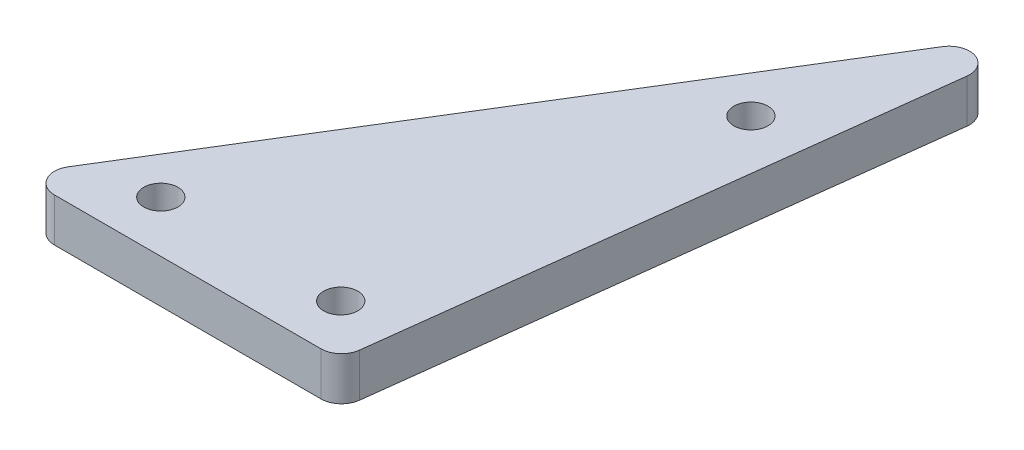
ISO-10303-21;
HEADER;
FILE_DESCRIPTION(('STEP AP214'),'2;1');
FILE_NAME('part.step','',(''),(''),'','','');
FILE_SCHEMA(('AUTOMOTIVE_DESIGN { 1 0 10303 214 1 1 1 1 }'));
ENDSEC;
DATA;
#1=APPLICATION_CONTEXT('core data for automotive mechanical design processes');
#2=APPLICATION_PROTOCOL_DEFINITION('international standard','automotive_design',2000,#1);
#3=PRODUCT_CONTEXT('',#1,'mechanical');
#4=PRODUCT('Part','Part','',(#3));
#5=PRODUCT_RELATED_PRODUCT_CATEGORY('part','',(#4));
#6=PRODUCT_DEFINITION_FORMATION('','',#4);
#7=PRODUCT_DEFINITION_CONTEXT('part definition',#1,'design');
#8=PRODUCT_DEFINITION('design','',#6,#7);
#9=PRODUCT_DEFINITION_SHAPE('','',#8);
#10=(LENGTH_UNIT() NAMED_UNIT(*) SI_UNIT(.MILLI.,.METRE.));
#11=(NAMED_UNIT(*) PLANE_ANGLE_UNIT() SI_UNIT($,.RADIAN.));
#12=(NAMED_UNIT(*) SI_UNIT($,.STERADIAN.) SOLID_ANGLE_UNIT());
#13=UNCERTAINTY_MEASURE_WITH_UNIT(LENGTH_MEASURE(1.E-05),#10,'distance_accuracy_value','');
#14=(GEOMETRIC_REPRESENTATION_CONTEXT(3) GLOBAL_UNCERTAINTY_ASSIGNED_CONTEXT((#13)) GLOBAL_UNIT_ASSIGNED_CONTEXT((#10,
#11,#12)) REPRESENTATION_CONTEXT('',''));
#15=CARTESIAN_POINT('',(0.,0.,0.));
#16=DIRECTION('',(0.,0.,1.));
#17=DIRECTION('',(1.,0.,0.));
#18=AXIS2_PLACEMENT_3D('',#15,#16,#17);
#19=CARTESIAN_POINT('',(44.3458242063322,6.35,-3.));
#20=DIRECTION('',(0.,-1.,0.));
#21=DIRECTION('',(0.,0.,-1.));
#22=AXIS2_PLACEMENT_3D('',#19,#20,#21);
#23=CYLINDRICAL_SURFACE('',#22,3.);
#24=CARTESIAN_POINT('',(44.3458242063322,0.,-3.));
#25=DIRECTION('',(0.,1.,0.));
#26=DIRECTION('',(0.,0.,1.));
#27=AXIS2_PLACEMENT_3D('',#24,#25,#26);
#28=CIRCLE('',#27,3.);
#29=CARTESIAN_POINT('',(44.3458242063322,0.,0.));
#30=VERTEX_POINT('',#29);
#31=CARTESIAN_POINT('',(47.3234626612561,0.,-2.63439196978457));
#32=VERTEX_POINT('',#31);
#33=EDGE_CURVE('E128',#30,#32,#28,.T.);
#34=ORIENTED_EDGE('',*,*,#33,.T.);
#35=DIRECTION('',(0.,-1.,0.));
#36=VECTOR('',#35,1.);
#37=CARTESIAN_POINT('',(47.3234626612561,6.35,-2.63439196978457));
#38=LINE('',#37,#36);
#39=CARTESIAN_POINT('',(47.3234626612561,6.35,-2.63439196978457));
#40=VERTEX_POINT('',#39);
#41=EDGE_CURVE('E11',#40,#32,#38,.T.);
#42=ORIENTED_EDGE('',*,*,#41,.F.);
#43=CARTESIAN_POINT('',(44.3458242063322,6.35,-3.));
#44=DIRECTION('',(0.,1.,0.));
#45=DIRECTION('',(0.,0.,1.));
#46=AXIS2_PLACEMENT_3D('',#43,#44,#45);
#47=CIRCLE('',#46,3.);
#48=CARTESIAN_POINT('',(44.3458242063322,6.35,0.));
#49=VERTEX_POINT('',#48);
#50=EDGE_CURVE('E145',#49,#40,#47,.T.);
#51=ORIENTED_EDGE('',*,*,#50,.F.);
#52=DIRECTION('',(0.,-1.,0.));
#53=VECTOR('',#52,1.);
#54=CARTESIAN_POINT('',(44.3458242063322,6.35,0.));
#55=LINE('',#54,#53);
#56=EDGE_CURVE('E124',#49,#30,#55,.T.);
#57=ORIENTED_EDGE('',*,*,#56,.T.);
#58=EDGE_LOOP('',(#34,#42,#51,#57));
#59=FACE_BOUND('',#58,.T.);
#60=ADVANCED_FACE('F39',(#59),#23,.T.);
#61=CARTESIAN_POINT('',(47.3234626612561,6.35,-2.63439196978457));
#62=DIRECTION('',(-0.992546151641322,0.,-0.121869343405144));
#63=DIRECTION('',(-0.121869343405144,0.,0.992546151641322));
#64=AXIS2_PLACEMENT_3D('',#61,#62,#63);
#65=PLANE('',#64);
#66=DIRECTION('',(0.121869343405144,0.,-0.992546151641322));
#67=VECTOR('',#66,1.);
#68=CARTESIAN_POINT('',(47.3234626612561,0.,-2.63439196978457));
#69=LINE('',#68,#67);
#70=CARTESIAN_POINT('',(57.0401379242615,0.,-81.7703614398336));
#71=VERTEX_POINT('',#70);
#72=EDGE_CURVE('E132',#32,#71,#69,.T.);
#73=ORIENTED_EDGE('',*,*,#72,.T.);
#74=DIRECTION('',(0.,-1.,0.));
#75=VECTOR('',#74,1.);
#76=CARTESIAN_POINT('',(57.0401379242615,6.35,-81.7703614398336));
#77=LINE('',#76,#75);
#78=CARTESIAN_POINT('',(57.0401379242615,6.35,-81.7703614398336));
#79=VERTEX_POINT('',#78);
#80=EDGE_CURVE('E48',#79,#71,#77,.T.);
#81=ORIENTED_EDGE('',*,*,#80,.F.);
#82=DIRECTION('',(0.121869343405144,0.,-0.992546151641322));
#83=VECTOR('',#82,1.);
#84=CARTESIAN_POINT('',(47.3234626612561,6.35,-2.63439196978457));
#85=LINE('',#84,#83);
#86=EDGE_CURVE('E93',#40,#79,#85,.T.);
#87=ORIENTED_EDGE('',*,*,#86,.F.);
#88=ORIENTED_EDGE('',*,*,#41,.T.);
#89=EDGE_LOOP('',(#73,#81,#87,#88));
#90=FACE_BOUND('',#89,.T.);
#91=ADVANCED_FACE('F174',(#90),#65,.F.);
#92=CARTESIAN_POINT('',(54.0624994693375,6.35,-82.135969470049));
#93=DIRECTION('',(0.,-1.,0.));
#94=DIRECTION('',(0.,0.,-1.));
#95=AXIS2_PLACEMENT_3D('',#92,#93,#94);
#96=CYLINDRICAL_SURFACE('',#95,3.);
#97=CARTESIAN_POINT('',(54.0624994693375,0.,-82.135969470049));
#98=DIRECTION('',(0.,1.,0.));
#99=DIRECTION('',(0.,0.,1.));
#100=AXIS2_PLACEMENT_3D('',#97,#98,#99);
#101=CIRCLE('',#100,3.);
#102=CARTESIAN_POINT('',(51.5074529688442,0.,-83.7081454717476));
#103=VERTEX_POINT('',#102);
#104=EDGE_CURVE('E136',#71,#103,#101,.T.);
#105=ORIENTED_EDGE('',*,*,#104,.T.);
#106=DIRECTION('',(0.,-1.,0.));
#107=VECTOR('',#106,1.);
#108=CARTESIAN_POINT('',(51.5074529688442,6.35,-83.7081454717476));
#109=LINE('',#108,#107);
#110=CARTESIAN_POINT('',(51.5074529688442,6.35,-83.7081454717476));
#111=VERTEX_POINT('',#110);
#112=EDGE_CURVE('E117',#111,#103,#109,.T.);
#113=ORIENTED_EDGE('',*,*,#112,.F.);
#114=CARTESIAN_POINT('',(54.0624994693375,6.35,-82.135969470049));
#115=DIRECTION('',(0.,1.,0.));
#116=DIRECTION('',(0.,0.,1.));
#117=AXIS2_PLACEMENT_3D('',#114,#115,#116);
#118=CIRCLE('',#117,3.);
#119=EDGE_CURVE('E106',#79,#111,#118,.T.);
#120=ORIENTED_EDGE('',*,*,#119,.F.);
#121=ORIENTED_EDGE('',*,*,#80,.T.);
#122=EDGE_LOOP('',(#105,#113,#120,#121));
#123=FACE_BOUND('',#122,.T.);
#124=ADVANCED_FACE('F155',(#123),#96,.T.);
#125=CARTESIAN_POINT('',(51.5074529688442,6.35,-83.7081454717476));
#126=DIRECTION('',(0.851682166831112,0.,0.524058667232841));
#127=DIRECTION('',(0.524058667232841,0.,-0.851682166831112));
#128=AXIS2_PLACEMENT_3D('',#125,#126,#127);
#129=PLANE('',#128);
#130=DIRECTION('',(-0.524058667232841,0.,0.851682166831112));
#131=VECTOR('',#130,1.);
#132=CARTESIAN_POINT('',(51.5074529688442,0.,-83.7081454717476));
#133=LINE('',#132,#131);
#134=CARTESIAN_POINT('',(2.81335990715803,0.,-4.57217600169856));
#135=VERTEX_POINT('',#134);
#136=EDGE_CURVE('E115',#103,#135,#133,.T.);
#137=ORIENTED_EDGE('',*,*,#136,.T.);
#138=DIRECTION('',(0.,-1.,0.));
#139=VECTOR('',#138,1.);
#140=CARTESIAN_POINT('',(2.81335990715803,6.35,-4.57217600169856));
#141=LINE('',#140,#139);
#142=CARTESIAN_POINT('',(2.81335990715803,6.35,-4.57217600169856));
#143=VERTEX_POINT('',#142);
#144=EDGE_CURVE('E112',#143,#135,#141,.T.);
#145=ORIENTED_EDGE('',*,*,#144,.F.);
#146=DIRECTION('',(-0.524058667232841,0.,0.851682166831112));
#147=VECTOR('',#146,1.);
#148=CARTESIAN_POINT('',(51.5074529688442,6.35,-83.7081454717476));
#149=LINE('',#148,#147);
#150=EDGE_CURVE('E100',#111,#143,#149,.T.);
#151=ORIENTED_EDGE('',*,*,#150,.F.);
#152=ORIENTED_EDGE('',*,*,#112,.T.);
#153=EDGE_LOOP('',(#137,#145,#151,#152));
#154=FACE_BOUND('',#153,.T.);
#155=ADVANCED_FACE('F113',(#154),#129,.F.);
#156=CARTESIAN_POINT('',(5.36840640765135,6.35,-3.));
#157=DIRECTION('',(0.,-1.,0.));
#158=DIRECTION('',(0.,0.,-1.));
#159=AXIS2_PLACEMENT_3D('',#156,#157,#158);
#160=CYLINDRICAL_SURFACE('',#159,3.);
#161=CARTESIAN_POINT('',(5.36840640765135,0.,-3.));
#162=DIRECTION('',(0.,1.,0.));
#163=DIRECTION('',(0.,0.,-1.));
#164=AXIS2_PLACEMENT_3D('',#161,#162,#163);
#165=CIRCLE('',#164,3.);
#166=CARTESIAN_POINT('',(5.36840640765139,0.,0.));
#167=VERTEX_POINT('',#166);
#168=EDGE_CURVE('E79',#135,#167,#165,.T.);
#169=ORIENTED_EDGE('',*,*,#168,.T.);
#170=DIRECTION('',(0.,-1.,0.));
#171=VECTOR('',#170,1.);
#172=CARTESIAN_POINT('',(5.36840640765139,6.35,0.));
#173=LINE('',#172,#171);
#174=CARTESIAN_POINT('',(5.36840640765139,6.35,0.));
#175=VERTEX_POINT('',#174);
#176=EDGE_CURVE('E118',#175,#167,#173,.T.);
#177=ORIENTED_EDGE('',*,*,#176,.F.);
#178=CARTESIAN_POINT('',(5.36840640765135,6.35,-3.));
#179=DIRECTION('',(0.,1.,0.));
#180=DIRECTION('',(0.,0.,-1.));
#181=AXIS2_PLACEMENT_3D('',#178,#179,#180);
#182=CIRCLE('',#181,3.);
#183=EDGE_CURVE('E104',#143,#175,#182,.T.);
#184=ORIENTED_EDGE('',*,*,#183,.F.);
#185=ORIENTED_EDGE('',*,*,#144,.T.);
#186=EDGE_LOOP('',(#169,#177,#184,#185));
#187=FACE_BOUND('',#186,.T.);
#188=ADVANCED_FACE('F120',(#187),#160,.T.);
#189=CARTESIAN_POINT('',(5.36840640765139,6.35,0.));
#190=DIRECTION('',(0.,0.,-1.));
#191=DIRECTION('',(-1.,0.,0.));
#192=AXIS2_PLACEMENT_3D('',#189,#190,#191);
#193=PLANE('',#192);
#194=DIRECTION('',(1.,0.,0.));
#195=VECTOR('',#194,1.);
#196=CARTESIAN_POINT('',(5.36840640765139,0.,0.));
#197=LINE('',#196,#195);
#198=EDGE_CURVE('E85',#167,#30,#197,.T.);
#199=ORIENTED_EDGE('',*,*,#198,.T.);
#200=ORIENTED_EDGE('',*,*,#56,.F.);
#201=DIRECTION('',(1.,0.,0.));
#202=VECTOR('',#201,1.);
#203=CARTESIAN_POINT('',(5.36840640765139,6.35,0.));
#204=LINE('',#203,#202);
#205=EDGE_CURVE('E56',#175,#49,#204,.T.);
#206=ORIENTED_EDGE('',*,*,#205,.F.);
#207=ORIENTED_EDGE('',*,*,#176,.T.);
#208=EDGE_LOOP('',(#199,#200,#206,#207));
#209=FACE_BOUND('',#208,.T.);
#210=ADVANCED_FACE('F162',(#209),#193,.F.);
#211=CARTESIAN_POINT('',(44.3458242063322,6.35,-3.));
#212=DIRECTION('',(0.,1.,0.));
#213=DIRECTION('',(0.,0.,1.));
#214=AXIS2_PLACEMENT_3D('',#211,#212,#213);
#215=PLANE('',#214);
#216=CARTESIAN_POINT('',(46.295472729734,6.35,-60.9264392048388));
#217=DIRECTION('',(0.,1.,0.));
#218=DIRECTION('',(0.,0.,1.));
#219=AXIS2_PLACEMENT_3D('',#216,#217,#218);
#220=CIRCLE('',#219,2.5);
#221=CARTESIAN_POINT('',(46.295472729734,6.35,-58.4264392048388));
#222=VERTEX_POINT('',#221);
#223=EDGE_CURVE('E249',#222,#222,#220,.T.);
#224=ORIENTED_EDGE('',*,*,#223,.F.);
#225=EDGE_LOOP('',(#224));
#226=FACE_BOUND('',#225,.T.);
#227=CARTESIAN_POINT('',(13.4210160191283,6.35,-7.50000000000001));
#228=DIRECTION('',(0.,1.,0.));
#229=DIRECTION('',(0.,0.,1.));
#230=AXIS2_PLACEMENT_3D('',#227,#228,#229);
#231=CIRCLE('',#230,2.5);
#232=CARTESIAN_POINT('',(13.4210160191283,6.35,-5.00000000000001));
#233=VERTEX_POINT('',#232);
#234=EDGE_CURVE('E257',#233,#233,#231,.T.);
#235=ORIENTED_EDGE('',*,*,#234,.F.);
#236=EDGE_LOOP('',(#235));
#237=FACE_BOUND('',#236,.T.);
#238=CARTESIAN_POINT('',(39.7355308513623,6.35,-7.5));
#239=DIRECTION('',(0.,1.,0.));
#240=DIRECTION('',(0.,0.,1.));
#241=AXIS2_PLACEMENT_3D('',#238,#239,#240);
#242=CIRCLE('',#241,2.5);
#243=CARTESIAN_POINT('',(39.7355308513623,6.35,-5.));
#244=VERTEX_POINT('',#243);
#245=EDGE_CURVE('E267',#244,#244,#242,.T.);
#246=ORIENTED_EDGE('',*,*,#245,.F.);
#247=EDGE_LOOP('',(#246));
#248=FACE_BOUND('',#247,.T.);
#249=ORIENTED_EDGE('',*,*,#50,.T.);
#250=ORIENTED_EDGE('',*,*,#86,.T.);
#251=ORIENTED_EDGE('',*,*,#119,.T.);
#252=ORIENTED_EDGE('',*,*,#150,.T.);
#253=ORIENTED_EDGE('',*,*,#183,.T.);
#254=ORIENTED_EDGE('',*,*,#205,.T.);
#255=EDGE_LOOP('',(#249,#250,#251,#252,#253,#254));
#256=FACE_BOUND('',#255,.T.);
#257=ADVANCED_FACE('F102',(#226,#237,#248,#256),#215,.T.);
#258=CARTESIAN_POINT('',(44.3458242063322,0.,-3.));
#259=DIRECTION('',(0.,1.,0.));
#260=DIRECTION('',(0.,0.,1.));
#261=AXIS2_PLACEMENT_3D('',#258,#259,#260);
#262=PLANE('',#261);
#263=CARTESIAN_POINT('',(46.295472729734,0.,-60.9264392048388));
#264=DIRECTION('',(0.,1.,0.));
#265=DIRECTION('',(0.,0.,1.));
#266=AXIS2_PLACEMENT_3D('',#263,#264,#265);
#267=CIRCLE('',#266,2.5);
#268=CARTESIAN_POINT('',(46.295472729734,0.,-58.4264392048388));
#269=VERTEX_POINT('',#268);
#270=EDGE_CURVE('E133',#269,#269,#267,.T.);
#271=ORIENTED_EDGE('',*,*,#270,.T.);
#272=EDGE_LOOP('',(#271));
#273=FACE_BOUND('',#272,.T.);
#274=CARTESIAN_POINT('',(13.4210160191283,0.,-7.50000000000001));
#275=DIRECTION('',(0.,1.,0.));
#276=DIRECTION('',(0.,0.,1.));
#277=AXIS2_PLACEMENT_3D('',#274,#275,#276);
#278=CIRCLE('',#277,2.5);
#279=CARTESIAN_POINT('',(13.4210160191283,0.,-5.00000000000001));
#280=VERTEX_POINT('',#279);
#281=EDGE_CURVE('E251',#280,#280,#278,.T.);
#282=ORIENTED_EDGE('',*,*,#281,.T.);
#283=EDGE_LOOP('',(#282));
#284=FACE_BOUND('',#283,.T.);
#285=CARTESIAN_POINT('',(39.7355308513623,0.,-7.5));
#286=DIRECTION('',(0.,1.,0.));
#287=DIRECTION('',(0.,0.,1.));
#288=AXIS2_PLACEMENT_3D('',#285,#286,#287);
#289=CIRCLE('',#288,2.5);
#290=CARTESIAN_POINT('',(39.7355308513623,0.,-5.));
#291=VERTEX_POINT('',#290);
#292=EDGE_CURVE('E263',#291,#291,#289,.T.);
#293=ORIENTED_EDGE('',*,*,#292,.T.);
#294=EDGE_LOOP('',(#293));
#295=FACE_BOUND('',#294,.T.);
#296=ORIENTED_EDGE('',*,*,#33,.F.);
#297=ORIENTED_EDGE('',*,*,#198,.F.);
#298=ORIENTED_EDGE('',*,*,#168,.F.);
#299=ORIENTED_EDGE('',*,*,#136,.F.);
#300=ORIENTED_EDGE('',*,*,#104,.F.);
#301=ORIENTED_EDGE('',*,*,#72,.F.);
#302=EDGE_LOOP('',(#296,#297,#298,#299,#300,#301));
#303=FACE_BOUND('',#302,.T.);
#304=ADVANCED_FACE('F158',(#273,#284,#295,#303),#262,.F.);
#305=CARTESIAN_POINT('',(39.7355308513623,0.,-7.5));
#306=DIRECTION('',(0.,1.,0.));
#307=DIRECTION('',(0.,0.,1.));
#308=AXIS2_PLACEMENT_3D('',#305,#306,#307);
#309=CYLINDRICAL_SURFACE('',#308,2.5);
#310=ORIENTED_EDGE('',*,*,#292,.F.);
#311=EDGE_LOOP('',(#310));
#312=FACE_BOUND('',#311,.T.);
#313=ORIENTED_EDGE('',*,*,#245,.T.);
#314=EDGE_LOOP('',(#313));
#315=FACE_BOUND('',#314,.T.);
#316=ADVANCED_FACE('F211',(#312,#315),#309,.F.);
#317=CARTESIAN_POINT('',(13.4210160191283,0.,-7.50000000000001));
#318=DIRECTION('',(0.,1.,0.));
#319=DIRECTION('',(0.,0.,1.));
#320=AXIS2_PLACEMENT_3D('',#317,#318,#319);
#321=CYLINDRICAL_SURFACE('',#320,2.5);
#322=ORIENTED_EDGE('',*,*,#281,.F.);
#323=EDGE_LOOP('',(#322));
#324=FACE_BOUND('',#323,.T.);
#325=ORIENTED_EDGE('',*,*,#234,.T.);
#326=EDGE_LOOP('',(#325));
#327=FACE_BOUND('',#326,.T.);
#328=ADVANCED_FACE('F220',(#324,#327),#321,.F.);
#329=CARTESIAN_POINT('',(46.295472729734,0.,-60.9264392048388));
#330=DIRECTION('',(0.,1.,0.));
#331=DIRECTION('',(0.,0.,1.));
#332=AXIS2_PLACEMENT_3D('',#329,#330,#331);
#333=CYLINDRICAL_SURFACE('',#332,2.5);
#334=ORIENTED_EDGE('',*,*,#270,.F.);
#335=EDGE_LOOP('',(#334));
#336=FACE_BOUND('',#335,.T.);
#337=ORIENTED_EDGE('',*,*,#223,.T.);
#338=EDGE_LOOP('',(#337));
#339=FACE_BOUND('',#338,.T.);
#340=ADVANCED_FACE('F230',(#336,#339),#333,.F.);
#341=CLOSED_SHELL('',(#60,#91,#124,#155,#188,#210,#257,#304,#316,#328,#340));
#342=MANIFOLD_SOLID_BREP('B2',#341);
#343=ADVANCED_BREP_SHAPE_REPRESENTATION('',(#18,#342),#14);
#344=SHAPE_DEFINITION_REPRESENTATION(#9,#343);
ENDSEC;
END-ISO-10303-21;
